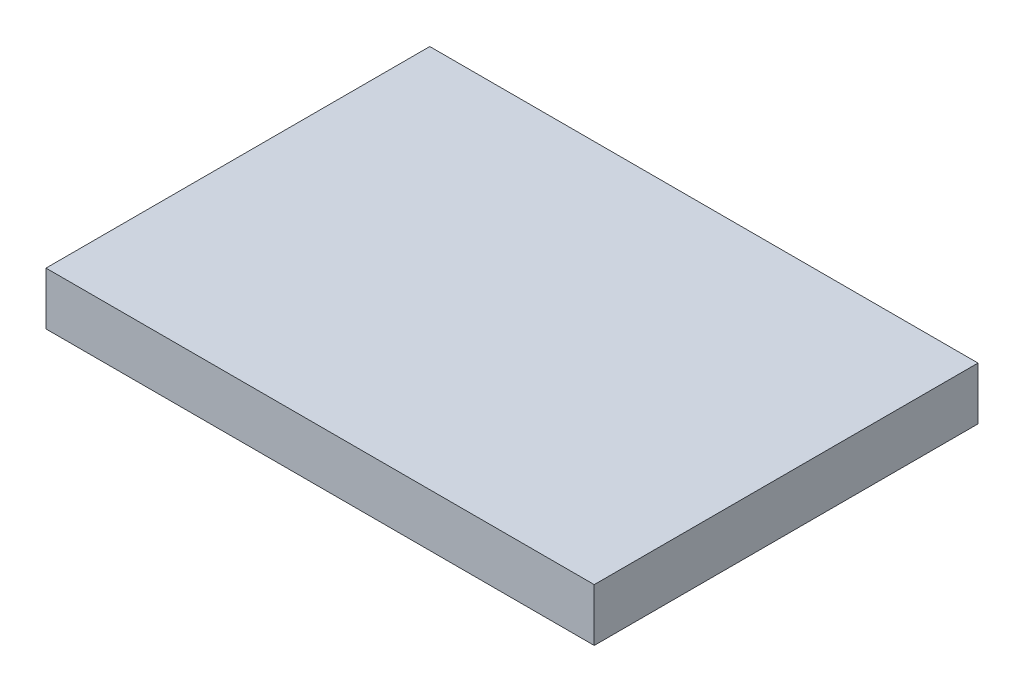
ISO-10303-21;
HEADER;
FILE_DESCRIPTION(('STEP AP214'),'2;1');
FILE_NAME('part.step','',(''),(''),'','','');
FILE_SCHEMA(('AUTOMOTIVE_DESIGN { 1 0 10303 214 1 1 1 1 }'));
ENDSEC;
DATA;
#1=APPLICATION_CONTEXT('core data for automotive mechanical design processes');
#2=APPLICATION_PROTOCOL_DEFINITION('international standard','automotive_design',2000,#1);
#3=PRODUCT_CONTEXT('',#1,'mechanical');
#4=PRODUCT('Part','Part','',(#3));
#5=PRODUCT_RELATED_PRODUCT_CATEGORY('part','',(#4));
#6=PRODUCT_DEFINITION_FORMATION('','',#4);
#7=PRODUCT_DEFINITION_CONTEXT('part definition',#1,'design');
#8=PRODUCT_DEFINITION('design','',#6,#7);
#9=PRODUCT_DEFINITION_SHAPE('','',#8);
#10=(LENGTH_UNIT() NAMED_UNIT(*) SI_UNIT(.MILLI.,.METRE.));
#11=(NAMED_UNIT(*) PLANE_ANGLE_UNIT() SI_UNIT($,.RADIAN.));
#12=(NAMED_UNIT(*) SI_UNIT($,.STERADIAN.) SOLID_ANGLE_UNIT());
#13=UNCERTAINTY_MEASURE_WITH_UNIT(LENGTH_MEASURE(1.E-05),#10,'distance_accuracy_value','');
#14=(GEOMETRIC_REPRESENTATION_CONTEXT(3) GLOBAL_UNCERTAINTY_ASSIGNED_CONTEXT((#13)) GLOBAL_UNIT_ASSIGNED_CONTEXT((#10,
#11,#12)) REPRESENTATION_CONTEXT('',''));
#15=CARTESIAN_POINT('',(0.,0.,0.));
#16=DIRECTION('',(0.,0.,1.));
#17=DIRECTION('',(1.,0.,0.));
#18=AXIS2_PLACEMENT_3D('',#15,#16,#17);
#19=CARTESIAN_POINT('',(16.51,3.175,-11.557));
#20=DIRECTION('',(-1.,0.,0.));
#21=DIRECTION('',(0.,0.,1.));
#22=AXIS2_PLACEMENT_3D('',#19,#20,#21);
#23=PLANE('',#22);
#24=DIRECTION('',(0.,0.,-1.));
#25=VECTOR('',#24,1.);
#26=CARTESIAN_POINT('',(16.51,0.,-11.557));
#27=LINE('',#26,#25);
#28=CARTESIAN_POINT('',(16.51,0.,11.557));
#29=VERTEX_POINT('',#28);
#30=CARTESIAN_POINT('',(16.51,0.,-11.557));
#31=VERTEX_POINT('',#30);
#32=EDGE_CURVE('E96',#29,#31,#27,.T.);
#33=ORIENTED_EDGE('',*,*,#32,.T.);
#34=DIRECTION('',(0.,-1.,0.));
#35=VECTOR('',#34,1.);
#36=CARTESIAN_POINT('',(16.51,3.175,-11.557));
#37=LINE('',#36,#35);
#38=CARTESIAN_POINT('',(16.51,3.175,-11.557));
#39=VERTEX_POINT('',#38);
#40=EDGE_CURVE('E11',#39,#31,#37,.T.);
#41=ORIENTED_EDGE('',*,*,#40,.F.);
#42=DIRECTION('',(0.,0.,-1.));
#43=VECTOR('',#42,1.);
#44=CARTESIAN_POINT('',(16.51,3.175,-11.557));
#45=LINE('',#44,#43);
#46=CARTESIAN_POINT('',(16.51,3.175,11.557));
#47=VERTEX_POINT('',#46);
#48=EDGE_CURVE('E84',#47,#39,#45,.T.);
#49=ORIENTED_EDGE('',*,*,#48,.F.);
#50=DIRECTION('',(0.,-1.,0.));
#51=VECTOR('',#50,1.);
#52=CARTESIAN_POINT('',(16.51,3.175,11.557));
#53=LINE('',#52,#51);
#54=EDGE_CURVE('E92',#47,#29,#53,.T.);
#55=ORIENTED_EDGE('',*,*,#54,.T.);
#56=EDGE_LOOP('',(#33,#41,#49,#55));
#57=FACE_BOUND('',#56,.T.);
#58=ADVANCED_FACE('F33',(#57),#23,.F.);
#59=CARTESIAN_POINT('',(-16.51,3.175,-11.557));
#60=DIRECTION('',(0.,0.,1.));
#61=DIRECTION('',(1.,0.,0.));
#62=AXIS2_PLACEMENT_3D('',#59,#60,#61);
#63=PLANE('',#62);
#64=DIRECTION('',(-1.,0.,0.));
#65=VECTOR('',#64,1.);
#66=CARTESIAN_POINT('',(-16.51,0.,-11.557));
#67=LINE('',#66,#65);
#68=CARTESIAN_POINT('',(-16.51,0.,-11.557));
#69=VERTEX_POINT('',#68);
#70=EDGE_CURVE('E88',#31,#69,#67,.T.);
#71=ORIENTED_EDGE('',*,*,#70,.T.);
#72=DIRECTION('',(0.,-1.,0.));
#73=VECTOR('',#72,1.);
#74=CARTESIAN_POINT('',(-16.51,3.175,-11.557));
#75=LINE('',#74,#73);
#76=CARTESIAN_POINT('',(-16.51,3.175,-11.557));
#77=VERTEX_POINT('',#76);
#78=EDGE_CURVE('E41',#77,#69,#75,.T.);
#79=ORIENTED_EDGE('',*,*,#78,.F.);
#80=DIRECTION('',(-1.,0.,0.));
#81=VECTOR('',#80,1.);
#82=CARTESIAN_POINT('',(-16.51,3.175,-11.557));
#83=LINE('',#82,#81);
#84=EDGE_CURVE('E79',#39,#77,#83,.T.);
#85=ORIENTED_EDGE('',*,*,#84,.F.);
#86=ORIENTED_EDGE('',*,*,#40,.T.);
#87=EDGE_LOOP('',(#71,#79,#85,#86));
#88=FACE_BOUND('',#87,.T.);
#89=ADVANCED_FACE('F87',(#88),#63,.F.);
#90=CARTESIAN_POINT('',(-16.51,3.175,-11.557));
#91=DIRECTION('',(1.,0.,0.));
#92=DIRECTION('',(0.,0.,-1.));
#93=AXIS2_PLACEMENT_3D('',#90,#91,#92);
#94=PLANE('',#93);
#95=DIRECTION('',(0.,0.,1.));
#96=VECTOR('',#95,1.);
#97=CARTESIAN_POINT('',(-16.51,0.,-11.557));
#98=LINE('',#97,#96);
#99=CARTESIAN_POINT('',(-16.51,0.,11.557));
#100=VERTEX_POINT('',#99);
#101=EDGE_CURVE('E66',#69,#100,#98,.T.);
#102=ORIENTED_EDGE('',*,*,#101,.T.);
#103=DIRECTION('',(0.,-1.,0.));
#104=VECTOR('',#103,1.);
#105=CARTESIAN_POINT('',(-16.51,3.175,11.557));
#106=LINE('',#105,#104);
#107=CARTESIAN_POINT('',(-16.51,3.175,11.557));
#108=VERTEX_POINT('',#107);
#109=EDGE_CURVE('E89',#108,#100,#106,.T.);
#110=ORIENTED_EDGE('',*,*,#109,.F.);
#111=DIRECTION('',(0.,0.,1.));
#112=VECTOR('',#111,1.);
#113=CARTESIAN_POINT('',(-16.51,3.175,-11.557));
#114=LINE('',#113,#112);
#115=EDGE_CURVE('E82',#77,#108,#114,.T.);
#116=ORIENTED_EDGE('',*,*,#115,.F.);
#117=ORIENTED_EDGE('',*,*,#78,.T.);
#118=EDGE_LOOP('',(#102,#110,#116,#117));
#119=FACE_BOUND('',#118,.T.);
#120=ADVANCED_FACE('F90',(#119),#94,.F.);
#121=CARTESIAN_POINT('',(-16.51,3.175,11.557));
#122=DIRECTION('',(0.,0.,-1.));
#123=DIRECTION('',(-1.,0.,0.));
#124=AXIS2_PLACEMENT_3D('',#121,#122,#123);
#125=PLANE('',#124);
#126=DIRECTION('',(1.,0.,0.));
#127=VECTOR('',#126,1.);
#128=CARTESIAN_POINT('',(-16.51,0.,11.557));
#129=LINE('',#128,#127);
#130=EDGE_CURVE('E72',#100,#29,#129,.T.);
#131=ORIENTED_EDGE('',*,*,#130,.T.);
#132=ORIENTED_EDGE('',*,*,#54,.F.);
#133=DIRECTION('',(1.,0.,0.));
#134=VECTOR('',#133,1.);
#135=CARTESIAN_POINT('',(-16.51,3.175,11.557));
#136=LINE('',#135,#134);
#137=EDGE_CURVE('E49',#108,#47,#136,.T.);
#138=ORIENTED_EDGE('',*,*,#137,.F.);
#139=ORIENTED_EDGE('',*,*,#109,.T.);
#140=EDGE_LOOP('',(#131,#132,#138,#139));
#141=FACE_BOUND('',#140,.T.);
#142=ADVANCED_FACE('F103',(#141),#125,.F.);
#143=CARTESIAN_POINT('',(0.,3.175,0.));
#144=DIRECTION('',(0.,1.,0.));
#145=DIRECTION('',(0.,0.,1.));
#146=AXIS2_PLACEMENT_3D('',#143,#144,#145);
#147=PLANE('',#146);
#148=ORIENTED_EDGE('',*,*,#48,.T.);
#149=ORIENTED_EDGE('',*,*,#84,.T.);
#150=ORIENTED_EDGE('',*,*,#115,.T.);
#151=ORIENTED_EDGE('',*,*,#137,.T.);
#152=EDGE_LOOP('',(#148,#149,#150,#151));
#153=FACE_BOUND('',#152,.T.);
#154=ADVANCED_FACE('F80',(#153),#147,.T.);
#155=CARTESIAN_POINT('',(0.,0.,0.));
#156=DIRECTION('',(0.,1.,0.));
#157=DIRECTION('',(0.,0.,1.));
#158=AXIS2_PLACEMENT_3D('',#155,#156,#157);
#159=PLANE('',#158);
#160=ORIENTED_EDGE('',*,*,#32,.F.);
#161=ORIENTED_EDGE('',*,*,#130,.F.);
#162=ORIENTED_EDGE('',*,*,#101,.F.);
#163=ORIENTED_EDGE('',*,*,#70,.F.);
#164=EDGE_LOOP('',(#160,#161,#162,#163));
#165=FACE_BOUND('',#164,.T.);
#166=ADVANCED_FACE('F106',(#165),#159,.F.);
#167=CLOSED_SHELL('',(#58,#89,#120,#142,#154,#166));
#168=MANIFOLD_SOLID_BREP('B2',#167);
#169=ADVANCED_BREP_SHAPE_REPRESENTATION('',(#18,#168),#14);
#170=SHAPE_DEFINITION_REPRESENTATION(#9,#169);
ENDSEC;
END-ISO-10303-21;
